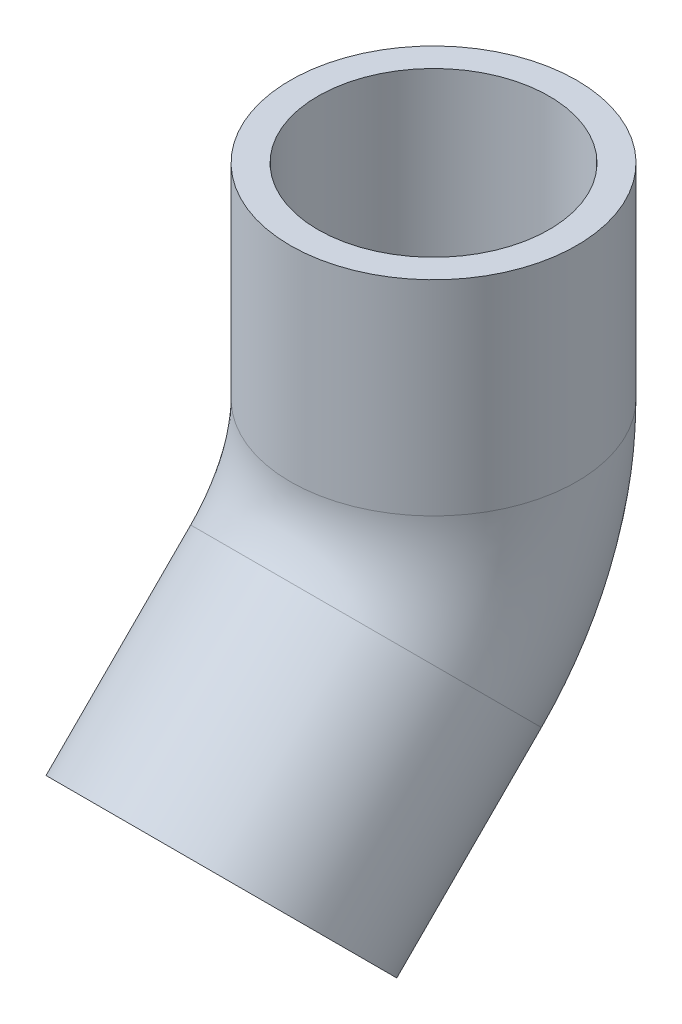
ISO-10303-21;
HEADER;
FILE_DESCRIPTION(('STEP AP214'),'2;1');
FILE_NAME('part.step','',(''),(''),'','','');
FILE_SCHEMA(('AUTOMOTIVE_DESIGN { 1 0 10303 214 1 1 1 1 }'));
ENDSEC;
DATA;
#1=APPLICATION_CONTEXT('core data for automotive mechanical design processes');
#2=APPLICATION_PROTOCOL_DEFINITION('international standard','automotive_design',2000,#1);
#3=PRODUCT_CONTEXT('',#1,'mechanical');
#4=PRODUCT('Part','Part','',(#3));
#5=PRODUCT_RELATED_PRODUCT_CATEGORY('part','',(#4));
#6=PRODUCT_DEFINITION_FORMATION('','',#4);
#7=PRODUCT_DEFINITION_CONTEXT('part definition',#1,'design');
#8=PRODUCT_DEFINITION('design','',#6,#7);
#9=PRODUCT_DEFINITION_SHAPE('','',#8);
#10=(LENGTH_UNIT() NAMED_UNIT(*) SI_UNIT(.MILLI.,.METRE.));
#11=(NAMED_UNIT(*) PLANE_ANGLE_UNIT() SI_UNIT($,.RADIAN.));
#12=(NAMED_UNIT(*) SI_UNIT($,.STERADIAN.) SOLID_ANGLE_UNIT());
#13=UNCERTAINTY_MEASURE_WITH_UNIT(LENGTH_MEASURE(1.E-05),#10,'distance_accuracy_value','');
#14=(GEOMETRIC_REPRESENTATION_CONTEXT(3) GLOBAL_UNCERTAINTY_ASSIGNED_CONTEXT((#13)) GLOBAL_UNIT_ASSIGNED_CONTEXT((#10,
#11,#12)) REPRESENTATION_CONTEXT('',''));
#15=CARTESIAN_POINT('',(0.,0.,0.));
#16=DIRECTION('',(0.,0.,1.));
#17=DIRECTION('',(1.,0.,0.));
#18=AXIS2_PLACEMENT_3D('',#15,#16,#17);
#19=CARTESIAN_POINT('',(0.,34.925,0.));
#20=DIRECTION('',(0.,-1.,0.));
#21=DIRECTION('',(0.,0.,-1.));
#22=AXIS2_PLACEMENT_3D('',#19,#20,#21);
#23=CYLINDRICAL_SURFACE('',#22,16.66875);
#24=CARTESIAN_POINT('',(0.,11.1125,0.));
#25=DIRECTION('',(0.,1.,0.));
#26=DIRECTION('',(0.,0.,1.));
#27=AXIS2_PLACEMENT_3D('',#24,#25,#26);
#28=CIRCLE('',#27,16.66875);
#29=CARTESIAN_POINT('',(0.,11.1125,-16.66875));
#30=VERTEX_POINT('',#29);
#31=EDGE_CURVE('E58',#30,#30,#28,.T.);
#32=ORIENTED_EDGE('',*,*,#31,.T.);
#33=EDGE_LOOP('',(#32));
#34=FACE_BOUND('',#33,.T.);
#35=CARTESIAN_POINT('',(0.,34.925,0.));
#36=DIRECTION('',(0.,1.,0.));
#37=DIRECTION('',(0.,0.,1.));
#38=AXIS2_PLACEMENT_3D('',#35,#36,#37);
#39=CIRCLE('',#38,16.66875);
#40=CARTESIAN_POINT('',(0.,34.925,16.66875));
#41=VERTEX_POINT('',#40);
#42=EDGE_CURVE('E41',#41,#41,#39,.T.);
#43=ORIENTED_EDGE('',*,*,#42,.F.);
#44=EDGE_LOOP('',(#43));
#45=FACE_BOUND('',#44,.T.);
#46=ADVANCED_FACE('F32',(#34,#45),#23,.T.);
#47=CARTESIAN_POINT('',(0.,11.1125,26.827948211871));
#48=DIRECTION('',(-1.,0.,0.));
#49=DIRECTION('',(0.,0.,1.));
#50=AXIS2_PLACEMENT_3D('',#47,#48,#49);
#51=TOROIDAL_SURFACE('',#50,26.827948211871,16.66875);
#52=CARTESIAN_POINT('',(0.,-7.85772410593549,7.8577241059355));
#53=DIRECTION('',(0.,0.707106781186547,-0.707106781186548));
#54=DIRECTION('',(0.,0.707106781186548,0.707106781186547));
#55=AXIS2_PLACEMENT_3D('',#52,#53,#54);
#56=CIRCLE('',#55,16.66875);
#57=CARTESIAN_POINT('',(0.,-19.6443102648388,-3.92886205296777));
#58=VERTEX_POINT('',#57);
#59=EDGE_CURVE('E36',#58,#58,#56,.T.);
#60=CARTESIAN_POINT('',(0.,11.1125,26.827948211871));
#61=DIRECTION('',(-1.,0.,0.));
#62=DIRECTION('',(0.,0.,1.));
#63=AXIS2_PLACEMENT_3D('',#60,#61,#62);
#64=CIRCLE('',#63,43.496698211871);
#65=EDGE_CURVE('',#30,#58,#64,.T.);
#66=ORIENTED_EDGE('',*,*,#31,.F.);
#67=ORIENTED_EDGE('',*,*,#59,.T.);
#68=ORIENTED_EDGE('',*,*,#65,.T.);
#69=ORIENTED_EDGE('',*,*,#65,.F.);
#70=EDGE_LOOP('',(#66,#68,#67,#69));
#71=FACE_BOUND('',#70,.T.);
#72=ADVANCED_FACE('F54',(#71),#51,.T.);
#73=CARTESIAN_POINT('',(0.,-7.8577241059355,7.8577241059355));
#74=DIRECTION('',(0.,-0.707106781186557,0.707106781186538));
#75=DIRECTION('',(0.,-0.707106781186538,-0.707106781186557));
#76=AXIS2_PLACEMENT_3D('',#73,#74,#75);
#77=CYLINDRICAL_SURFACE('',#76,16.66875);
#78=CARTESIAN_POINT('',(0.,-24.6957043329404,24.6957043329399));
#79=DIRECTION('',(0.,0.707106781186557,-0.707106781186538));
#80=DIRECTION('',(0.,0.707106781186538,0.707106781186557));
#81=AXIS2_PLACEMENT_3D('',#78,#79,#80);
#82=CIRCLE('',#81,16.66875);
#83=CARTESIAN_POINT('',(0.,-12.9091181740373,36.4822904918434));
#84=VERTEX_POINT('',#83);
#85=EDGE_CURVE('E11',#84,#84,#82,.T.);
#86=ORIENTED_EDGE('',*,*,#85,.T.);
#87=EDGE_LOOP('',(#86));
#88=FACE_BOUND('',#87,.T.);
#89=ORIENTED_EDGE('',*,*,#59,.F.);
#90=EDGE_LOOP('',(#89));
#91=FACE_BOUND('',#90,.T.);
#92=ADVANCED_FACE('F34',(#88,#91),#77,.T.);
#93=CARTESIAN_POINT('',(0.,34.925,0.));
#94=DIRECTION('',(0.,1.,0.));
#95=DIRECTION('',(0.,0.,1.));
#96=AXIS2_PLACEMENT_3D('',#93,#94,#95);
#97=PLANE('',#96);
#98=CARTESIAN_POINT('',(0.,34.925,0.));
#99=DIRECTION('',(0.,1.,0.));
#100=DIRECTION('',(0.,0.,1.));
#101=AXIS2_PLACEMENT_3D('',#98,#99,#100);
#102=CIRCLE('',#101,13.462);
#103=CARTESIAN_POINT('',(0.,34.925,13.462));
#104=VERTEX_POINT('',#103);
#105=EDGE_CURVE('E68',#104,#104,#102,.T.);
#106=ORIENTED_EDGE('',*,*,#105,.F.);
#107=EDGE_LOOP('',(#106));
#108=FACE_BOUND('',#107,.T.);
#109=ORIENTED_EDGE('',*,*,#42,.T.);
#110=EDGE_LOOP('',(#109));
#111=FACE_BOUND('',#110,.T.);
#112=ADVANCED_FACE('F53',(#108,#111),#97,.T.);
#113=CARTESIAN_POINT('',(0.,-24.6957043329404,24.6957043329399));
#114=DIRECTION('',(0.,0.707106781186557,-0.707106781186538));
#115=DIRECTION('',(0.,0.707106781186538,0.707106781186557));
#116=AXIS2_PLACEMENT_3D('',#113,#114,#115);
#117=PLANE('',#116);
#118=CARTESIAN_POINT('',(0.,-24.6957043329404,24.6957043329399));
#119=DIRECTION('',(0.,-0.707106781186556,0.707106781186539));
#120=DIRECTION('',(0.,-0.707106781186539,-0.707106781186556));
#121=AXIS2_PLACEMENT_3D('',#118,#119,#120);
#122=CIRCLE('',#121,13.462);
#123=CARTESIAN_POINT('',(0.,-34.2147758212736,15.1766328446065));
#124=VERTEX_POINT('',#123);
#125=EDGE_CURVE('E77',#124,#124,#122,.T.);
#126=ORIENTED_EDGE('',*,*,#125,.F.);
#127=EDGE_LOOP('',(#126));
#128=FACE_BOUND('',#127,.T.);
#129=ORIENTED_EDGE('',*,*,#85,.F.);
#130=EDGE_LOOP('',(#129));
#131=FACE_BOUND('',#130,.T.);
#132=ADVANCED_FACE('F49',(#128,#131),#117,.F.);
#133=CARTESIAN_POINT('',(0.,11.1125,26.827948211871));
#134=DIRECTION('',(-1.,0.,0.));
#135=DIRECTION('',(0.,0.,1.));
#136=AXIS2_PLACEMENT_3D('',#133,#134,#135);
#137=TOROIDAL_SURFACE('',#136,26.827948211871,10.4648);
#138=CARTESIAN_POINT('',(0.,11.1125,0.));
#139=DIRECTION('',(0.,1.,0.));
#140=DIRECTION('',(0.,0.,1.));
#141=AXIS2_PLACEMENT_3D('',#138,#139,#140);
#142=CIRCLE('',#141,10.4648);
#143=CARTESIAN_POINT('',(0.,11.1125,-10.4648));
#144=VERTEX_POINT('',#143);
#145=EDGE_CURVE('E61',#144,#144,#142,.F.);
#146=CARTESIAN_POINT('',(0.,-7.85772410593551,7.85772410593551));
#147=DIRECTION('',(0.,-0.707106781186556,0.707106781186539));
#148=DIRECTION('',(0.,-0.707106781186539,-0.707106781186556));
#149=AXIS2_PLACEMENT_3D('',#146,#147,#148);
#150=CIRCLE('',#149,10.4648);
#151=CARTESIAN_POINT('',(0.,-15.2574551496965,0.457993062174533));
#152=VERTEX_POINT('',#151);
#153=EDGE_CURVE('E71',#152,#152,#150,.F.);
#154=CARTESIAN_POINT('',(0.,11.1125,26.827948211871));
#155=DIRECTION('',(-1.,0.,0.));
#156=DIRECTION('',(0.,0.,1.));
#157=AXIS2_PLACEMENT_3D('',#154,#155,#156);
#158=CIRCLE('',#157,37.292748211871);
#159=EDGE_CURVE('',#144,#152,#158,.T.);
#160=ORIENTED_EDGE('',*,*,#145,.F.);
#161=ORIENTED_EDGE('',*,*,#153,.F.);
#162=ORIENTED_EDGE('',*,*,#159,.T.);
#163=ORIENTED_EDGE('',*,*,#159,.F.);
#164=EDGE_LOOP('',(#160,#162,#161,#163));
#165=FACE_BOUND('',#164,.T.);
#166=ADVANCED_FACE('F93',(#165),#137,.F.);
#167=CARTESIAN_POINT('',(0.,11.1125,0.));
#168=DIRECTION('',(0.,1.,0.));
#169=DIRECTION('',(0.,0.,1.));
#170=AXIS2_PLACEMENT_3D('',#167,#168,#169);
#171=PLANE('',#170);
#172=CARTESIAN_POINT('',(0.,11.1125,0.));
#173=DIRECTION('',(0.,1.,0.));
#174=DIRECTION('',(0.,0.,1.));
#175=AXIS2_PLACEMENT_3D('',#172,#173,#174);
#176=CIRCLE('',#175,13.462);
#177=CARTESIAN_POINT('',(0.,11.1125,13.462));
#178=VERTEX_POINT('',#177);
#179=EDGE_CURVE('E65',#178,#178,#176,.T.);
#180=ORIENTED_EDGE('',*,*,#179,.T.);
#181=EDGE_LOOP('',(#180));
#182=FACE_BOUND('',#181,.T.);
#183=ORIENTED_EDGE('',*,*,#145,.T.);
#184=EDGE_LOOP('',(#183));
#185=FACE_BOUND('',#184,.T.);
#186=ADVANCED_FACE('F99',(#182,#185),#171,.T.);
#187=CARTESIAN_POINT('',(0.,11.1125,0.));
#188=DIRECTION('',(0.,1.,0.));
#189=DIRECTION('',(0.,0.,1.));
#190=AXIS2_PLACEMENT_3D('',#187,#188,#189);
#191=CYLINDRICAL_SURFACE('',#190,13.462);
#192=ORIENTED_EDGE('',*,*,#179,.F.);
#193=EDGE_LOOP('',(#192));
#194=FACE_BOUND('',#193,.T.);
#195=ORIENTED_EDGE('',*,*,#105,.T.);
#196=EDGE_LOOP('',(#195));
#197=FACE_BOUND('',#196,.T.);
#198=ADVANCED_FACE('F134',(#194,#197),#191,.F.);
#199=CARTESIAN_POINT('',(0.,-7.85772410593558,7.85772410593543));
#200=DIRECTION('',(0.,-0.707106781186556,0.707106781186539));
#201=DIRECTION('',(0.,-0.707106781186539,-0.707106781186556));
#202=AXIS2_PLACEMENT_3D('',#199,#200,#201);
#203=PLANE('',#202);
#204=CARTESIAN_POINT('',(0.,-7.85772410593558,7.85772410593543));
#205=DIRECTION('',(0.,-0.707106781186556,0.707106781186539));
#206=DIRECTION('',(0.,-0.707106781186539,-0.707106781186556));
#207=AXIS2_PLACEMENT_3D('',#204,#205,#206);
#208=CIRCLE('',#207,13.462);
#209=CARTESIAN_POINT('',(0.,-17.3767955942688,-1.66134738239798));
#210=VERTEX_POINT('',#209);
#211=EDGE_CURVE('E76',#210,#210,#208,.T.);
#212=ORIENTED_EDGE('',*,*,#211,.T.);
#213=EDGE_LOOP('',(#212));
#214=FACE_BOUND('',#213,.T.);
#215=ORIENTED_EDGE('',*,*,#153,.T.);
#216=EDGE_LOOP('',(#215));
#217=FACE_BOUND('',#216,.T.);
#218=ADVANCED_FACE('F83',(#214,#217),#203,.T.);
#219=CARTESIAN_POINT('',(0.,-7.85772410593558,7.85772410593543));
#220=DIRECTION('',(0.,-0.707106781186556,0.707106781186539));
#221=DIRECTION('',(0.,-0.707106781186539,-0.707106781186556));
#222=AXIS2_PLACEMENT_3D('',#219,#220,#221);
#223=CYLINDRICAL_SURFACE('',#222,13.462);
#224=ORIENTED_EDGE('',*,*,#211,.F.);
#225=EDGE_LOOP('',(#224));
#226=FACE_BOUND('',#225,.T.);
#227=ORIENTED_EDGE('',*,*,#125,.T.);
#228=EDGE_LOOP('',(#227));
#229=FACE_BOUND('',#228,.T.);
#230=ADVANCED_FACE('F86',(#226,#229),#223,.F.);
#231=CLOSED_SHELL('',(#46,#72,#92,#112,#132,#166,#186,#198,#218,#230));
#232=MANIFOLD_SOLID_BREP('B2',#231);
#233=ADVANCED_BREP_SHAPE_REPRESENTATION('',(#18,#232),#14);
#234=SHAPE_DEFINITION_REPRESENTATION(#9,#233);
ENDSEC;
END-ISO-10303-21;
